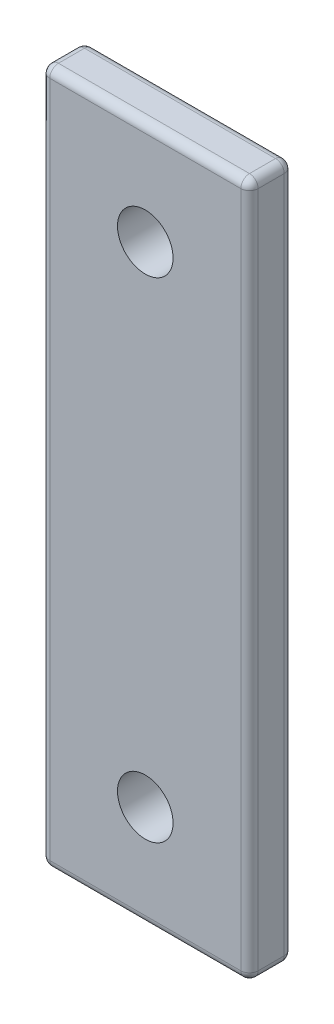
ISO-10303-21;
HEADER;
FILE_DESCRIPTION(('STEP AP214'),'2;1');
FILE_NAME('part.step','',(''),(''),'','','');
FILE_SCHEMA(('AUTOMOTIVE_DESIGN { 1 0 10303 214 1 1 1 1 }'));
ENDSEC;
DATA;
#1=APPLICATION_CONTEXT('core data for automotive mechanical design processes');
#2=APPLICATION_PROTOCOL_DEFINITION('international standard','automotive_design',2000,#1);
#3=PRODUCT_CONTEXT('',#1,'mechanical');
#4=PRODUCT('Part','Part','',(#3));
#5=PRODUCT_RELATED_PRODUCT_CATEGORY('part','',(#4));
#6=PRODUCT_DEFINITION_FORMATION('','',#4);
#7=PRODUCT_DEFINITION_CONTEXT('part definition',#1,'design');
#8=PRODUCT_DEFINITION('design','',#6,#7);
#9=PRODUCT_DEFINITION_SHAPE('','',#8);
#10=(LENGTH_UNIT() NAMED_UNIT(*) SI_UNIT(.MILLI.,.METRE.));
#11=(NAMED_UNIT(*) PLANE_ANGLE_UNIT() SI_UNIT($,.RADIAN.));
#12=(NAMED_UNIT(*) SI_UNIT($,.STERADIAN.) SOLID_ANGLE_UNIT());
#13=UNCERTAINTY_MEASURE_WITH_UNIT(LENGTH_MEASURE(1.E-05),#10,'distance_accuracy_value','');
#14=(GEOMETRIC_REPRESENTATION_CONTEXT(3) GLOBAL_UNCERTAINTY_ASSIGNED_CONTEXT((#13)) GLOBAL_UNIT_ASSIGNED_CONTEXT((#10,
#11,#12)) REPRESENTATION_CONTEXT('',''));
#15=CARTESIAN_POINT('',(0.,0.,0.));
#16=DIRECTION('',(0.,0.,1.));
#17=DIRECTION('',(1.,0.,0.));
#18=AXIS2_PLACEMENT_3D('',#15,#16,#17);
#19=CARTESIAN_POINT('',(24.,-80.,10.));
#20=DIRECTION('',(-1.,0.,0.));
#21=DIRECTION('',(0.,0.,1.));
#22=AXIS2_PLACEMENT_3D('',#19,#20,#21);
#23=PLANE('',#22);
#24=DIRECTION('',(0.,1.,0.));
#25=VECTOR('',#24,1.);
#26=CARTESIAN_POINT('',(24.,80.,2.));
#27=LINE('',#26,#25);
#28=CARTESIAN_POINT('',(24.,-78.,2.));
#29=VERTEX_POINT('',#28);
#30=CARTESIAN_POINT('',(24.,78.,2.));
#31=VERTEX_POINT('',#30);
#32=EDGE_CURVE('E191',#29,#31,#27,.T.);
#33=ORIENTED_EDGE('',*,*,#32,.T.);
#34=DIRECTION('',(0.,0.,-1.));
#35=VECTOR('',#34,1.);
#36=CARTESIAN_POINT('',(24.,78.,10.));
#37=LINE('',#36,#35);
#38=CARTESIAN_POINT('',(24.,78.,8.));
#39=VERTEX_POINT('',#38);
#40=EDGE_CURVE('E238',#31,#39,#37,.F.);
#41=ORIENTED_EDGE('',*,*,#40,.T.);
#42=DIRECTION('',(0.,1.,0.));
#43=VECTOR('',#42,1.);
#44=CARTESIAN_POINT('',(24.,-80.,8.));
#45=LINE('',#44,#43);
#46=CARTESIAN_POINT('',(24.,-78.,8.));
#47=VERTEX_POINT('',#46);
#48=EDGE_CURVE('E194',#39,#47,#45,.F.);
#49=ORIENTED_EDGE('',*,*,#48,.T.);
#50=DIRECTION('',(0.,0.,-1.));
#51=VECTOR('',#50,1.);
#52=CARTESIAN_POINT('',(24.,-78.,10.));
#53=LINE('',#52,#51);
#54=EDGE_CURVE('E236',#47,#29,#53,.T.);
#55=ORIENTED_EDGE('',*,*,#54,.T.);
#56=EDGE_LOOP('',(#33,#41,#49,#55));
#57=FACE_BOUND('',#56,.T.);
#58=ADVANCED_FACE('F41',(#57),#23,.F.);
#59=CARTESIAN_POINT('',(-24.,80.,10.));
#60=DIRECTION('',(0.,-1.,0.));
#61=DIRECTION('',(0.,0.,-1.));
#62=AXIS2_PLACEMENT_3D('',#59,#60,#61);
#63=PLANE('',#62);
#64=DIRECTION('',(-1.,0.,0.));
#65=VECTOR('',#64,1.);
#66=CARTESIAN_POINT('',(-24.,80.,8.));
#67=LINE('',#66,#65);
#68=CARTESIAN_POINT('',(-22.,80.,8.));
#69=VERTEX_POINT('',#68);
#70=CARTESIAN_POINT('',(22.,80.,8.));
#71=VERTEX_POINT('',#70);
#72=EDGE_CURVE('E188',#69,#71,#67,.F.);
#73=ORIENTED_EDGE('',*,*,#72,.T.);
#74=DIRECTION('',(0.,0.,-1.));
#75=VECTOR('',#74,1.);
#76=CARTESIAN_POINT('',(22.,80.,10.));
#77=LINE('',#76,#75);
#78=CARTESIAN_POINT('',(22.,80.,2.));
#79=VERTEX_POINT('',#78);
#80=EDGE_CURVE('E234',#71,#79,#77,.T.);
#81=ORIENTED_EDGE('',*,*,#80,.T.);
#82=DIRECTION('',(-1.,0.,0.));
#83=VECTOR('',#82,1.);
#84=CARTESIAN_POINT('',(-24.,80.,2.));
#85=LINE('',#84,#83);
#86=CARTESIAN_POINT('',(-22.,80.,2.));
#87=VERTEX_POINT('',#86);
#88=EDGE_CURVE('E185',#79,#87,#85,.T.);
#89=ORIENTED_EDGE('',*,*,#88,.T.);
#90=DIRECTION('',(0.,0.,-1.));
#91=VECTOR('',#90,1.);
#92=CARTESIAN_POINT('',(-22.,80.,10.));
#93=LINE('',#92,#91);
#94=EDGE_CURVE('E232',#87,#69,#93,.F.);
#95=ORIENTED_EDGE('',*,*,#94,.T.);
#96=EDGE_LOOP('',(#73,#81,#89,#95));
#97=FACE_BOUND('',#96,.T.);
#98=ADVANCED_FACE('F341',(#97),#63,.F.);
#99=CARTESIAN_POINT('',(-24.,-80.,10.));
#100=DIRECTION('',(1.,0.,0.));
#101=DIRECTION('',(0.,0.,-1.));
#102=AXIS2_PLACEMENT_3D('',#99,#100,#101);
#103=PLANE('',#102);
#104=DIRECTION('',(0.,-1.,0.));
#105=VECTOR('',#104,1.);
#106=CARTESIAN_POINT('',(-24.,-80.,2.));
#107=LINE('',#106,#105);
#108=CARTESIAN_POINT('',(-24.,78.,2.));
#109=VERTEX_POINT('',#108);
#110=CARTESIAN_POINT('',(-24.,-78.,2.));
#111=VERTEX_POINT('',#110);
#112=EDGE_CURVE('E181',#109,#111,#107,.T.);
#113=ORIENTED_EDGE('',*,*,#112,.T.);
#114=DIRECTION('',(0.,0.,-1.));
#115=VECTOR('',#114,1.);
#116=CARTESIAN_POINT('',(-24.,-78.,10.));
#117=LINE('',#116,#115);
#118=CARTESIAN_POINT('',(-24.,-78.,8.));
#119=VERTEX_POINT('',#118);
#120=EDGE_CURVE('E11',#111,#119,#117,.F.);
#121=ORIENTED_EDGE('',*,*,#120,.T.);
#122=DIRECTION('',(0.,-1.,0.));
#123=VECTOR('',#122,1.);
#124=CARTESIAN_POINT('',(-24.,-80.,8.));
#125=LINE('',#124,#123);
#126=CARTESIAN_POINT('',(-24.,78.,8.));
#127=VERTEX_POINT('',#126);
#128=EDGE_CURVE('E183',#119,#127,#125,.F.);
#129=ORIENTED_EDGE('',*,*,#128,.T.);
#130=DIRECTION('',(0.,0.,-1.));
#131=VECTOR('',#130,1.);
#132=CARTESIAN_POINT('',(-24.,78.,10.));
#133=LINE('',#132,#131);
#134=EDGE_CURVE('E50',#127,#109,#133,.T.);
#135=ORIENTED_EDGE('',*,*,#134,.T.);
#136=EDGE_LOOP('',(#113,#121,#129,#135));
#137=FACE_BOUND('',#136,.T.);
#138=ADVANCED_FACE('F329',(#137),#103,.F.);
#139=CARTESIAN_POINT('',(-24.,-80.,10.));
#140=DIRECTION('',(0.,1.,0.));
#141=DIRECTION('',(0.,0.,1.));
#142=AXIS2_PLACEMENT_3D('',#139,#140,#141);
#143=PLANE('',#142);
#144=DIRECTION('',(1.,0.,0.));
#145=VECTOR('',#144,1.);
#146=CARTESIAN_POINT('',(24.,-80.,2.));
#147=LINE('',#146,#145);
#148=CARTESIAN_POINT('',(-22.,-80.,2.));
#149=VERTEX_POINT('',#148);
#150=CARTESIAN_POINT('',(22.,-80.,2.));
#151=VERTEX_POINT('',#150);
#152=EDGE_CURVE('E173',#149,#151,#147,.T.);
#153=ORIENTED_EDGE('',*,*,#152,.T.);
#154=DIRECTION('',(0.,0.,-1.));
#155=VECTOR('',#154,1.);
#156=CARTESIAN_POINT('',(22.,-80.,10.));
#157=LINE('',#156,#155);
#158=CARTESIAN_POINT('',(22.,-80.,8.));
#159=VERTEX_POINT('',#158);
#160=EDGE_CURVE('E242',#151,#159,#157,.F.);
#161=ORIENTED_EDGE('',*,*,#160,.T.);
#162=DIRECTION('',(1.,0.,0.));
#163=VECTOR('',#162,1.);
#164=CARTESIAN_POINT('',(-24.,-80.,8.));
#165=LINE('',#164,#163);
#166=CARTESIAN_POINT('',(-22.,-80.,8.));
#167=VERTEX_POINT('',#166);
#168=EDGE_CURVE('E154',#159,#167,#165,.F.);
#169=ORIENTED_EDGE('',*,*,#168,.T.);
#170=DIRECTION('',(0.,0.,-1.));
#171=VECTOR('',#170,1.);
#172=CARTESIAN_POINT('',(-22.,-80.,10.));
#173=LINE('',#172,#171);
#174=EDGE_CURVE('E240',#167,#149,#173,.T.);
#175=ORIENTED_EDGE('',*,*,#174,.T.);
#176=EDGE_LOOP('',(#153,#161,#169,#175));
#177=FACE_BOUND('',#176,.T.);
#178=ADVANCED_FACE('F320',(#177),#143,.F.);
#179=CARTESIAN_POINT('',(0.,0.,10.));
#180=DIRECTION('',(0.,0.,-1.));
#181=DIRECTION('',(-1.,0.,0.));
#182=AXIS2_PLACEMENT_3D('',#179,#180,#181);
#183=PLANE('',#182);
#184=CARTESIAN_POINT('',(0.,-56.35,10.));
#185=DIRECTION('',(0.,0.,1.));
#186=DIRECTION('',(-1.,0.,0.));
#187=AXIS2_PLACEMENT_3D('',#184,#185,#186);
#188=CIRCLE('',#187,6.4);
#189=CARTESIAN_POINT('',(-6.4,-56.35,10.));
#190=VERTEX_POINT('',#189);
#191=EDGE_CURVE('E271',#190,#190,#188,.T.);
#192=ORIENTED_EDGE('',*,*,#191,.F.);
#193=EDGE_LOOP('',(#192));
#194=FACE_BOUND('',#193,.T.);
#195=CARTESIAN_POINT('',(0.,56.35,10.));
#196=DIRECTION('',(0.,0.,-1.));
#197=DIRECTION('',(-1.,0.,0.));
#198=AXIS2_PLACEMENT_3D('',#195,#196,#197);
#199=CIRCLE('',#198,6.4);
#200=CARTESIAN_POINT('',(-6.4,56.35,10.));
#201=VERTEX_POINT('',#200);
#202=EDGE_CURVE('E259',#201,#201,#199,.T.);
#203=ORIENTED_EDGE('',*,*,#202,.T.);
#204=EDGE_LOOP('',(#203));
#205=FACE_BOUND('',#204,.T.);
#206=DIRECTION('',(0.,-1.,0.));
#207=VECTOR('',#206,1.);
#208=CARTESIAN_POINT('',(-22.,0.,10.));
#209=LINE('',#208,#207);
#210=CARTESIAN_POINT('',(-22.,78.,10.));
#211=VERTEX_POINT('',#210);
#212=CARTESIAN_POINT('',(-22.,-78.,10.));
#213=VERTEX_POINT('',#212);
#214=EDGE_CURVE('E172',#211,#213,#209,.T.);
#215=ORIENTED_EDGE('',*,*,#214,.T.);
#216=DIRECTION('',(1.,0.,0.));
#217=VECTOR('',#216,1.);
#218=CARTESIAN_POINT('',(0.,-78.,10.));
#219=LINE('',#218,#217);
#220=CARTESIAN_POINT('',(22.,-78.,10.));
#221=VERTEX_POINT('',#220);
#222=EDGE_CURVE('E151',#213,#221,#219,.T.);
#223=ORIENTED_EDGE('',*,*,#222,.T.);
#224=DIRECTION('',(0.,1.,0.));
#225=VECTOR('',#224,1.);
#226=CARTESIAN_POINT('',(22.,0.,10.));
#227=LINE('',#226,#225);
#228=CARTESIAN_POINT('',(22.,78.,10.));
#229=VERTEX_POINT('',#228);
#230=EDGE_CURVE('E160',#221,#229,#227,.T.);
#231=ORIENTED_EDGE('',*,*,#230,.T.);
#232=DIRECTION('',(-1.,0.,0.));
#233=VECTOR('',#232,1.);
#234=CARTESIAN_POINT('',(0.,78.,10.));
#235=LINE('',#234,#233);
#236=EDGE_CURVE('E166',#229,#211,#235,.T.);
#237=ORIENTED_EDGE('',*,*,#236,.T.);
#238=EDGE_LOOP('',(#215,#223,#231,#237));
#239=FACE_BOUND('',#238,.T.);
#240=ADVANCED_FACE('F170',(#194,#205,#239),#183,.F.);
#241=CARTESIAN_POINT('',(0.,0.,0.));
#242=DIRECTION('',(0.,0.,-1.));
#243=DIRECTION('',(-1.,0.,0.));
#244=AXIS2_PLACEMENT_3D('',#241,#242,#243);
#245=PLANE('',#244);
#246=CARTESIAN_POINT('',(0.,-56.35,0.));
#247=DIRECTION('',(0.,0.,1.));
#248=DIRECTION('',(-1.,0.,0.));
#249=AXIS2_PLACEMENT_3D('',#246,#247,#248);
#250=CIRCLE('',#249,6.4);
#251=CARTESIAN_POINT('',(-6.4,-56.35,0.));
#252=VERTEX_POINT('',#251);
#253=EDGE_CURVE('E274',#252,#252,#250,.T.);
#254=ORIENTED_EDGE('',*,*,#253,.T.);
#255=EDGE_LOOP('',(#254));
#256=FACE_BOUND('',#255,.T.);
#257=CARTESIAN_POINT('',(0.,56.35,0.));
#258=DIRECTION('',(0.,0.,-1.));
#259=DIRECTION('',(-1.,0.,0.));
#260=AXIS2_PLACEMENT_3D('',#257,#258,#259);
#261=CIRCLE('',#260,6.4);
#262=CARTESIAN_POINT('',(-6.4,56.35,0.));
#263=VERTEX_POINT('',#262);
#264=EDGE_CURVE('E266',#263,#263,#261,.T.);
#265=ORIENTED_EDGE('',*,*,#264,.F.);
#266=EDGE_LOOP('',(#265));
#267=FACE_BOUND('',#266,.T.);
#268=DIRECTION('',(0.,-1.,0.));
#269=VECTOR('',#268,1.);
#270=CARTESIAN_POINT('',(-22.,80.,0.));
#271=LINE('',#270,#269);
#272=CARTESIAN_POINT('',(-22.,-78.,0.));
#273=VERTEX_POINT('',#272);
#274=CARTESIAN_POINT('',(-22.,78.,0.));
#275=VERTEX_POINT('',#274);
#276=EDGE_CURVE('E202',#273,#275,#271,.F.);
#277=ORIENTED_EDGE('',*,*,#276,.T.);
#278=DIRECTION('',(-1.,0.,0.));
#279=VECTOR('',#278,1.);
#280=CARTESIAN_POINT('',(24.,78.,0.));
#281=LINE('',#280,#279);
#282=CARTESIAN_POINT('',(22.,78.,0.));
#283=VERTEX_POINT('',#282);
#284=EDGE_CURVE('E143',#275,#283,#281,.F.);
#285=ORIENTED_EDGE('',*,*,#284,.T.);
#286=DIRECTION('',(0.,1.,0.));
#287=VECTOR('',#286,1.);
#288=CARTESIAN_POINT('',(22.,-80.,0.));
#289=LINE('',#288,#287);
#290=CARTESIAN_POINT('',(22.,-78.,0.));
#291=VERTEX_POINT('',#290);
#292=EDGE_CURVE('E196',#283,#291,#289,.F.);
#293=ORIENTED_EDGE('',*,*,#292,.T.);
#294=DIRECTION('',(1.,0.,0.));
#295=VECTOR('',#294,1.);
#296=CARTESIAN_POINT('',(-24.,-78.,0.));
#297=LINE('',#296,#295);
#298=EDGE_CURVE('E199',#291,#273,#297,.F.);
#299=ORIENTED_EDGE('',*,*,#298,.T.);
#300=EDGE_LOOP('',(#277,#285,#293,#299));
#301=FACE_BOUND('',#300,.T.);
#302=ADVANCED_FACE('F293',(#256,#267,#301),#245,.T.);
#303=CARTESIAN_POINT('',(0.,78.,8.));
#304=DIRECTION('',(-1.,0.,0.));
#305=DIRECTION('',(0.,0.,1.));
#306=AXIS2_PLACEMENT_3D('',#303,#304,#305);
#307=CYLINDRICAL_SURFACE('',#306,2.);
#308=ORIENTED_EDGE('',*,*,#236,.F.);
#309=CARTESIAN_POINT('',(22.,78.,8.));
#310=DIRECTION('',(-1.,0.,0.));
#311=DIRECTION('',(0.,0.,1.));
#312=AXIS2_PLACEMENT_3D('',#309,#310,#311);
#313=CIRCLE('',#312,2.);
#314=EDGE_CURVE('E210',#229,#71,#313,.T.);
#315=ORIENTED_EDGE('',*,*,#314,.T.);
#316=ORIENTED_EDGE('',*,*,#72,.F.);
#317=CARTESIAN_POINT('',(-22.,78.,8.));
#318=DIRECTION('',(-1.,0.,0.));
#319=DIRECTION('',(0.,0.,1.));
#320=AXIS2_PLACEMENT_3D('',#317,#318,#319);
#321=CIRCLE('',#320,2.);
#322=EDGE_CURVE('E208',#69,#211,#321,.F.);
#323=ORIENTED_EDGE('',*,*,#322,.T.);
#324=EDGE_LOOP('',(#308,#315,#316,#323));
#325=FACE_BOUND('',#324,.T.);
#326=ADVANCED_FACE('F357',(#325),#307,.T.);
#327=CARTESIAN_POINT('',(-22.,0.,8.));
#328=DIRECTION('',(0.,-1.,0.));
#329=DIRECTION('',(0.,0.,-1.));
#330=AXIS2_PLACEMENT_3D('',#327,#328,#329);
#331=CYLINDRICAL_SURFACE('',#330,2.);
#332=ORIENTED_EDGE('',*,*,#128,.F.);
#333=CARTESIAN_POINT('',(-22.,-78.,8.));
#334=DIRECTION('',(0.,-1.,0.));
#335=DIRECTION('',(0.,0.,-1.));
#336=AXIS2_PLACEMENT_3D('',#333,#334,#335);
#337=CIRCLE('',#336,2.);
#338=EDGE_CURVE('E227',#119,#213,#337,.F.);
#339=ORIENTED_EDGE('',*,*,#338,.T.);
#340=ORIENTED_EDGE('',*,*,#214,.F.);
#341=CARTESIAN_POINT('',(-22.,78.,8.));
#342=DIRECTION('',(0.,-1.,0.));
#343=DIRECTION('',(0.,0.,-1.));
#344=AXIS2_PLACEMENT_3D('',#341,#342,#343);
#345=CIRCLE('',#344,2.);
#346=EDGE_CURVE('E224',#211,#127,#345,.T.);
#347=ORIENTED_EDGE('',*,*,#346,.T.);
#348=EDGE_LOOP('',(#332,#339,#340,#347));
#349=FACE_BOUND('',#348,.T.);
#350=ADVANCED_FACE('F279',(#349),#331,.T.);
#351=CARTESIAN_POINT('',(22.,0.,8.));
#352=DIRECTION('',(0.,1.,0.));
#353=DIRECTION('',(0.,0.,1.));
#354=AXIS2_PLACEMENT_3D('',#351,#352,#353);
#355=CYLINDRICAL_SURFACE('',#354,2.);
#356=ORIENTED_EDGE('',*,*,#48,.F.);
#357=CARTESIAN_POINT('',(22.,78.,8.));
#358=DIRECTION('',(0.,1.,0.));
#359=DIRECTION('',(0.,0.,1.));
#360=AXIS2_PLACEMENT_3D('',#357,#358,#359);
#361=CIRCLE('',#360,2.);
#362=EDGE_CURVE('E142',#39,#229,#361,.F.);
#363=ORIENTED_EDGE('',*,*,#362,.T.);
#364=ORIENTED_EDGE('',*,*,#230,.F.);
#365=CARTESIAN_POINT('',(22.,-78.,8.));
#366=DIRECTION('',(0.,1.,0.));
#367=DIRECTION('',(0.,0.,1.));
#368=AXIS2_PLACEMENT_3D('',#365,#366,#367);
#369=CIRCLE('',#368,2.);
#370=EDGE_CURVE('E132',#221,#47,#369,.T.);
#371=ORIENTED_EDGE('',*,*,#370,.T.);
#372=EDGE_LOOP('',(#356,#363,#364,#371));
#373=FACE_BOUND('',#372,.T.);
#374=ADVANCED_FACE('F161',(#373),#355,.T.);
#375=CARTESIAN_POINT('',(0.,-78.,8.));
#376=DIRECTION('',(1.,0.,0.));
#377=DIRECTION('',(0.,0.,-1.));
#378=AXIS2_PLACEMENT_3D('',#375,#376,#377);
#379=CYLINDRICAL_SURFACE('',#378,2.);
#380=ORIENTED_EDGE('',*,*,#168,.F.);
#381=CARTESIAN_POINT('',(22.,-78.,8.));
#382=DIRECTION('',(1.,0.,0.));
#383=DIRECTION('',(0.,0.,-1.));
#384=AXIS2_PLACEMENT_3D('',#381,#382,#383);
#385=CIRCLE('',#384,2.);
#386=EDGE_CURVE('E135',#159,#221,#385,.F.);
#387=ORIENTED_EDGE('',*,*,#386,.T.);
#388=ORIENTED_EDGE('',*,*,#222,.F.);
#389=CARTESIAN_POINT('',(-22.,-78.,8.));
#390=DIRECTION('',(1.,0.,0.));
#391=DIRECTION('',(0.,0.,-1.));
#392=AXIS2_PLACEMENT_3D('',#389,#390,#391);
#393=CIRCLE('',#392,2.);
#394=EDGE_CURVE('E156',#213,#167,#393,.T.);
#395=ORIENTED_EDGE('',*,*,#394,.T.);
#396=EDGE_LOOP('',(#380,#387,#388,#395));
#397=FACE_BOUND('',#396,.T.);
#398=ADVANCED_FACE('F148',(#397),#379,.T.);
#399=CARTESIAN_POINT('',(-24.,-78.,2.));
#400=DIRECTION('',(-1.,0.,0.));
#401=DIRECTION('',(0.,0.,1.));
#402=AXIS2_PLACEMENT_3D('',#399,#400,#401);
#403=CYLINDRICAL_SURFACE('',#402,2.);
#404=ORIENTED_EDGE('',*,*,#298,.F.);
#405=CARTESIAN_POINT('',(22.,-78.,2.));
#406=DIRECTION('',(-1.,0.,0.));
#407=DIRECTION('',(0.,0.,1.));
#408=AXIS2_PLACEMENT_3D('',#405,#406,#407);
#409=CIRCLE('',#408,2.);
#410=EDGE_CURVE('E222',#291,#151,#409,.T.);
#411=ORIENTED_EDGE('',*,*,#410,.T.);
#412=ORIENTED_EDGE('',*,*,#152,.F.);
#413=CARTESIAN_POINT('',(-22.,-78.,2.));
#414=DIRECTION('',(-1.,0.,0.));
#415=DIRECTION('',(0.,0.,1.));
#416=AXIS2_PLACEMENT_3D('',#413,#414,#415);
#417=CIRCLE('',#416,2.);
#418=EDGE_CURVE('E155',#149,#273,#417,.F.);
#419=ORIENTED_EDGE('',*,*,#418,.T.);
#420=EDGE_LOOP('',(#404,#411,#412,#419));
#421=FACE_BOUND('',#420,.T.);
#422=ADVANCED_FACE('F309',(#421),#403,.T.);
#423=CARTESIAN_POINT('',(22.,-80.,2.));
#424=DIRECTION('',(0.,-1.,0.));
#425=DIRECTION('',(0.,0.,-1.));
#426=AXIS2_PLACEMENT_3D('',#423,#424,#425);
#427=CYLINDRICAL_SURFACE('',#426,2.);
#428=ORIENTED_EDGE('',*,*,#292,.F.);
#429=CARTESIAN_POINT('',(22.,78.,2.));
#430=DIRECTION('',(0.,-1.,0.));
#431=DIRECTION('',(0.,0.,-1.));
#432=AXIS2_PLACEMENT_3D('',#429,#430,#431);
#433=CIRCLE('',#432,2.);
#434=EDGE_CURVE('E218',#283,#31,#433,.T.);
#435=ORIENTED_EDGE('',*,*,#434,.T.);
#436=ORIENTED_EDGE('',*,*,#32,.F.);
#437=CARTESIAN_POINT('',(22.,-78.,2.));
#438=DIRECTION('',(0.,-1.,0.));
#439=DIRECTION('',(0.,0.,-1.));
#440=AXIS2_PLACEMENT_3D('',#437,#438,#439);
#441=CIRCLE('',#440,2.);
#442=EDGE_CURVE('E216',#29,#291,#441,.F.);
#443=ORIENTED_EDGE('',*,*,#442,.T.);
#444=EDGE_LOOP('',(#428,#435,#436,#443));
#445=FACE_BOUND('',#444,.T.);
#446=ADVANCED_FACE('F304',(#445),#427,.T.);
#447=CARTESIAN_POINT('',(-22.,-80.,2.));
#448=DIRECTION('',(0.,1.,0.));
#449=DIRECTION('',(0.,0.,1.));
#450=AXIS2_PLACEMENT_3D('',#447,#448,#449);
#451=CYLINDRICAL_SURFACE('',#450,2.);
#452=ORIENTED_EDGE('',*,*,#276,.F.);
#453=CARTESIAN_POINT('',(-22.,-78.,2.));
#454=DIRECTION('',(0.,1.,0.));
#455=DIRECTION('',(0.,0.,1.));
#456=AXIS2_PLACEMENT_3D('',#453,#454,#455);
#457=CIRCLE('',#456,2.);
#458=EDGE_CURVE('E58',#273,#111,#457,.T.);
#459=ORIENTED_EDGE('',*,*,#458,.T.);
#460=ORIENTED_EDGE('',*,*,#112,.F.);
#461=CARTESIAN_POINT('',(-22.,78.,2.));
#462=DIRECTION('',(0.,1.,0.));
#463=DIRECTION('',(0.,0.,1.));
#464=AXIS2_PLACEMENT_3D('',#461,#462,#463);
#465=CIRCLE('',#464,2.);
#466=EDGE_CURVE('E229',#109,#275,#465,.F.);
#467=ORIENTED_EDGE('',*,*,#466,.T.);
#468=EDGE_LOOP('',(#452,#459,#460,#467));
#469=FACE_BOUND('',#468,.T.);
#470=ADVANCED_FACE('F290',(#469),#451,.T.);
#471=CARTESIAN_POINT('',(-24.,78.,2.));
#472=DIRECTION('',(1.,0.,0.));
#473=DIRECTION('',(0.,0.,-1.));
#474=AXIS2_PLACEMENT_3D('',#471,#472,#473);
#475=CYLINDRICAL_SURFACE('',#474,2.);
#476=ORIENTED_EDGE('',*,*,#88,.F.);
#477=CARTESIAN_POINT('',(22.,78.,2.));
#478=DIRECTION('',(1.,0.,0.));
#479=DIRECTION('',(0.,0.,-1.));
#480=AXIS2_PLACEMENT_3D('',#477,#478,#479);
#481=CIRCLE('',#480,2.);
#482=EDGE_CURVE('E214',#79,#283,#481,.F.);
#483=ORIENTED_EDGE('',*,*,#482,.T.);
#484=ORIENTED_EDGE('',*,*,#284,.F.);
#485=CARTESIAN_POINT('',(-22.,78.,2.));
#486=DIRECTION('',(1.,0.,0.));
#487=DIRECTION('',(0.,0.,-1.));
#488=AXIS2_PLACEMENT_3D('',#485,#486,#487);
#489=CIRCLE('',#488,2.);
#490=EDGE_CURVE('E212',#275,#87,#489,.T.);
#491=ORIENTED_EDGE('',*,*,#490,.T.);
#492=EDGE_LOOP('',(#476,#483,#484,#491));
#493=FACE_BOUND('',#492,.T.);
#494=ADVANCED_FACE('F298',(#493),#475,.T.);
#495=CARTESIAN_POINT('',(22.,78.,2.));
#496=DIRECTION('',(0.,0.,1.));
#497=DIRECTION('',(1.,0.,0.));
#498=AXIS2_PLACEMENT_3D('',#495,#496,#497);
#499=SPHERICAL_SURFACE('',#498,2.);
#500=ORIENTED_EDGE('',*,*,#434,.F.);
#501=ORIENTED_EDGE('',*,*,#482,.F.);
#502=CARTESIAN_POINT('',(22.,78.,2.));
#503=DIRECTION('',(0.,0.,1.));
#504=DIRECTION('',(1.,0.,0.));
#505=AXIS2_PLACEMENT_3D('',#502,#503,#504);
#506=CIRCLE('',#505,2.);
#507=EDGE_CURVE('E167',#31,#79,#506,.T.);
#508=ORIENTED_EDGE('',*,*,#507,.F.);
#509=EDGE_LOOP('',(#500,#501,#508));
#510=FACE_BOUND('',#509,.T.);
#511=ADVANCED_FACE('F362',(#510),#499,.T.);
#512=CARTESIAN_POINT('',(22.,78.,10.));
#513=DIRECTION('',(0.,0.,-1.));
#514=DIRECTION('',(-1.,0.,0.));
#515=AXIS2_PLACEMENT_3D('',#512,#513,#514);
#516=CYLINDRICAL_SURFACE('',#515,2.);
#517=ORIENTED_EDGE('',*,*,#507,.T.);
#518=ORIENTED_EDGE('',*,*,#80,.F.);
#519=CARTESIAN_POINT('',(22.,78.,8.));
#520=DIRECTION('',(0.,0.,1.));
#521=DIRECTION('',(1.,0.,0.));
#522=AXIS2_PLACEMENT_3D('',#519,#520,#521);
#523=CIRCLE('',#522,2.);
#524=EDGE_CURVE('E245',#39,#71,#523,.T.);
#525=ORIENTED_EDGE('',*,*,#524,.F.);
#526=ORIENTED_EDGE('',*,*,#40,.F.);
#527=EDGE_LOOP('',(#517,#518,#525,#526));
#528=FACE_BOUND('',#527,.T.);
#529=ADVANCED_FACE('F372',(#528),#516,.T.);
#530=CARTESIAN_POINT('',(22.,78.,8.));
#531=DIRECTION('',(0.,0.,1.));
#532=DIRECTION('',(1.,0.,0.));
#533=AXIS2_PLACEMENT_3D('',#530,#531,#532);
#534=SPHERICAL_SURFACE('',#533,2.);
#535=ORIENTED_EDGE('',*,*,#524,.T.);
#536=ORIENTED_EDGE('',*,*,#314,.F.);
#537=ORIENTED_EDGE('',*,*,#362,.F.);
#538=EDGE_LOOP('',(#535,#536,#537));
#539=FACE_BOUND('',#538,.T.);
#540=ADVANCED_FACE('F369',(#539),#534,.T.);
#541=CARTESIAN_POINT('',(22.,-78.,2.));
#542=DIRECTION('',(0.,0.,1.));
#543=DIRECTION('',(1.,0.,0.));
#544=AXIS2_PLACEMENT_3D('',#541,#542,#543);
#545=SPHERICAL_SURFACE('',#544,2.);
#546=ORIENTED_EDGE('',*,*,#410,.F.);
#547=ORIENTED_EDGE('',*,*,#442,.F.);
#548=CARTESIAN_POINT('',(22.,-78.,2.));
#549=DIRECTION('',(0.,0.,1.));
#550=DIRECTION('',(1.,0.,0.));
#551=AXIS2_PLACEMENT_3D('',#548,#549,#550);
#552=CIRCLE('',#551,2.);
#553=EDGE_CURVE('E248',#151,#29,#552,.T.);
#554=ORIENTED_EDGE('',*,*,#553,.F.);
#555=EDGE_LOOP('',(#546,#547,#554));
#556=FACE_BOUND('',#555,.T.);
#557=ADVANCED_FACE('F314',(#556),#545,.T.);
#558=CARTESIAN_POINT('',(22.,-78.,10.));
#559=DIRECTION('',(0.,0.,-1.));
#560=DIRECTION('',(-1.,0.,0.));
#561=AXIS2_PLACEMENT_3D('',#558,#559,#560);
#562=CYLINDRICAL_SURFACE('',#561,2.);
#563=ORIENTED_EDGE('',*,*,#553,.T.);
#564=ORIENTED_EDGE('',*,*,#54,.F.);
#565=CARTESIAN_POINT('',(22.,-78.,8.));
#566=DIRECTION('',(0.,0.,1.));
#567=DIRECTION('',(1.,0.,0.));
#568=AXIS2_PLACEMENT_3D('',#565,#566,#567);
#569=CIRCLE('',#568,2.);
#570=EDGE_CURVE('E137',#159,#47,#569,.T.);
#571=ORIENTED_EDGE('',*,*,#570,.F.);
#572=ORIENTED_EDGE('',*,*,#160,.F.);
#573=EDGE_LOOP('',(#563,#564,#571,#572));
#574=FACE_BOUND('',#573,.T.);
#575=ADVANCED_FACE('F318',(#574),#562,.T.);
#576=CARTESIAN_POINT('',(22.,-78.,8.));
#577=DIRECTION('',(0.,0.,1.));
#578=DIRECTION('',(1.,0.,0.));
#579=AXIS2_PLACEMENT_3D('',#576,#577,#578);
#580=SPHERICAL_SURFACE('',#579,2.);
#581=ORIENTED_EDGE('',*,*,#570,.T.);
#582=ORIENTED_EDGE('',*,*,#370,.F.);
#583=ORIENTED_EDGE('',*,*,#386,.F.);
#584=EDGE_LOOP('',(#581,#582,#583));
#585=FACE_BOUND('',#584,.T.);
#586=ADVANCED_FACE('F134',(#585),#580,.T.);
#587=CARTESIAN_POINT('',(-22.,-78.,2.));
#588=DIRECTION('',(0.,0.,1.));
#589=DIRECTION('',(1.,0.,0.));
#590=AXIS2_PLACEMENT_3D('',#587,#588,#589);
#591=SPHERICAL_SURFACE('',#590,2.);
#592=ORIENTED_EDGE('',*,*,#458,.F.);
#593=ORIENTED_EDGE('',*,*,#418,.F.);
#594=CARTESIAN_POINT('',(-22.,-78.,2.));
#595=DIRECTION('',(0.,0.,1.));
#596=DIRECTION('',(1.,0.,0.));
#597=AXIS2_PLACEMENT_3D('',#594,#595,#596);
#598=CIRCLE('',#597,2.);
#599=EDGE_CURVE('E252',#111,#149,#598,.T.);
#600=ORIENTED_EDGE('',*,*,#599,.F.);
#601=EDGE_LOOP('',(#592,#593,#600));
#602=FACE_BOUND('',#601,.T.);
#603=ADVANCED_FACE('F324',(#602),#591,.T.);
#604=CARTESIAN_POINT('',(-22.,-78.,10.));
#605=DIRECTION('',(0.,0.,-1.));
#606=DIRECTION('',(-1.,0.,0.));
#607=AXIS2_PLACEMENT_3D('',#604,#605,#606);
#608=CYLINDRICAL_SURFACE('',#607,2.);
#609=ORIENTED_EDGE('',*,*,#599,.T.);
#610=ORIENTED_EDGE('',*,*,#174,.F.);
#611=CARTESIAN_POINT('',(-22.,-78.,8.));
#612=DIRECTION('',(0.,0.,1.));
#613=DIRECTION('',(1.,0.,0.));
#614=AXIS2_PLACEMENT_3D('',#611,#612,#613);
#615=CIRCLE('',#614,2.);
#616=EDGE_CURVE('E255',#119,#167,#615,.T.);
#617=ORIENTED_EDGE('',*,*,#616,.F.);
#618=ORIENTED_EDGE('',*,*,#120,.F.);
#619=EDGE_LOOP('',(#609,#610,#617,#618));
#620=FACE_BOUND('',#619,.T.);
#621=ADVANCED_FACE('F327',(#620),#608,.T.);
#622=CARTESIAN_POINT('',(-22.,-78.,8.));
#623=DIRECTION('',(0.,0.,1.));
#624=DIRECTION('',(1.,0.,0.));
#625=AXIS2_PLACEMENT_3D('',#622,#623,#624);
#626=SPHERICAL_SURFACE('',#625,2.);
#627=ORIENTED_EDGE('',*,*,#394,.F.);
#628=ORIENTED_EDGE('',*,*,#338,.F.);
#629=ORIENTED_EDGE('',*,*,#616,.T.);
#630=EDGE_LOOP('',(#627,#628,#629));
#631=FACE_BOUND('',#630,.T.);
#632=ADVANCED_FACE('F331',(#631),#626,.T.);
#633=CARTESIAN_POINT('',(-22.,78.,2.));
#634=DIRECTION('',(0.,0.,1.));
#635=DIRECTION('',(1.,0.,0.));
#636=AXIS2_PLACEMENT_3D('',#633,#634,#635);
#637=SPHERICAL_SURFACE('',#636,2.);
#638=ORIENTED_EDGE('',*,*,#490,.F.);
#639=ORIENTED_EDGE('',*,*,#466,.F.);
#640=CARTESIAN_POINT('',(-22.,78.,2.));
#641=DIRECTION('',(0.,0.,1.));
#642=DIRECTION('',(1.,0.,0.));
#643=AXIS2_PLACEMENT_3D('',#640,#641,#642);
#644=CIRCLE('',#643,2.);
#645=EDGE_CURVE('E45',#87,#109,#644,.T.);
#646=ORIENTED_EDGE('',*,*,#645,.F.);
#647=EDGE_LOOP('',(#638,#639,#646));
#648=FACE_BOUND('',#647,.T.);
#649=ADVANCED_FACE('F43',(#648),#637,.T.);
#650=CARTESIAN_POINT('',(-22.,78.,10.));
#651=DIRECTION('',(0.,0.,-1.));
#652=DIRECTION('',(-1.,0.,0.));
#653=AXIS2_PLACEMENT_3D('',#650,#651,#652);
#654=CYLINDRICAL_SURFACE('',#653,2.);
#655=ORIENTED_EDGE('',*,*,#645,.T.);
#656=ORIENTED_EDGE('',*,*,#134,.F.);
#657=CARTESIAN_POINT('',(-22.,78.,8.));
#658=DIRECTION('',(0.,0.,1.));
#659=DIRECTION('',(1.,0.,0.));
#660=AXIS2_PLACEMENT_3D('',#657,#658,#659);
#661=CIRCLE('',#660,2.);
#662=EDGE_CURVE('E258',#69,#127,#661,.T.);
#663=ORIENTED_EDGE('',*,*,#662,.F.);
#664=ORIENTED_EDGE('',*,*,#94,.F.);
#665=EDGE_LOOP('',(#655,#656,#663,#664));
#666=FACE_BOUND('',#665,.T.);
#667=ADVANCED_FACE('F285',(#666),#654,.T.);
#668=CARTESIAN_POINT('',(-22.,78.,8.));
#669=DIRECTION('',(0.,0.,1.));
#670=DIRECTION('',(1.,0.,0.));
#671=AXIS2_PLACEMENT_3D('',#668,#669,#670);
#672=SPHERICAL_SURFACE('',#671,2.);
#673=ORIENTED_EDGE('',*,*,#346,.F.);
#674=ORIENTED_EDGE('',*,*,#322,.F.);
#675=ORIENTED_EDGE('',*,*,#662,.T.);
#676=EDGE_LOOP('',(#673,#674,#675));
#677=FACE_BOUND('',#676,.T.);
#678=ADVANCED_FACE('F281',(#677),#672,.T.);
#679=CARTESIAN_POINT('',(0.,56.35,10.));
#680=DIRECTION('',(0.,0.,-1.));
#681=DIRECTION('',(-1.,0.,0.));
#682=AXIS2_PLACEMENT_3D('',#679,#680,#681);
#683=CYLINDRICAL_SURFACE('',#682,6.4);
#684=ORIENTED_EDGE('',*,*,#202,.F.);
#685=EDGE_LOOP('',(#684));
#686=FACE_BOUND('',#685,.T.);
#687=ORIENTED_EDGE('',*,*,#264,.T.);
#688=EDGE_LOOP('',(#687));
#689=FACE_BOUND('',#688,.T.);
#690=ADVANCED_FACE('F433',(#686,#689),#683,.F.);
#691=CARTESIAN_POINT('',(0.,-56.35,10.));
#692=DIRECTION('',(0.,0.,-1.));
#693=DIRECTION('',(-1.,0.,0.));
#694=AXIS2_PLACEMENT_3D('',#691,#692,#693);
#695=CYLINDRICAL_SURFACE('',#694,6.4);
#696=ORIENTED_EDGE('',*,*,#191,.T.);
#697=EDGE_LOOP('',(#696));
#698=FACE_BOUND('',#697,.T.);
#699=ORIENTED_EDGE('',*,*,#253,.F.);
#700=EDGE_LOOP('',(#699));
#701=FACE_BOUND('',#700,.T.);
#702=ADVANCED_FACE('F443',(#698,#701),#695,.F.);
#703=CLOSED_SHELL('',(#58,#98,#138,#178,#240,#302,#326,#350,#374,#398,#422,#446,#470,#494,#511,
#529,#540,#557,#575,#586,#603,#621,#632,#649,#667,#678,#690,#702));
#704=MANIFOLD_SOLID_BREP('B2',#703);
#705=ADVANCED_BREP_SHAPE_REPRESENTATION('',(#18,#704),#14);
#706=SHAPE_DEFINITION_REPRESENTATION(#9,#705);
ENDSEC;
END-ISO-10303-21;
